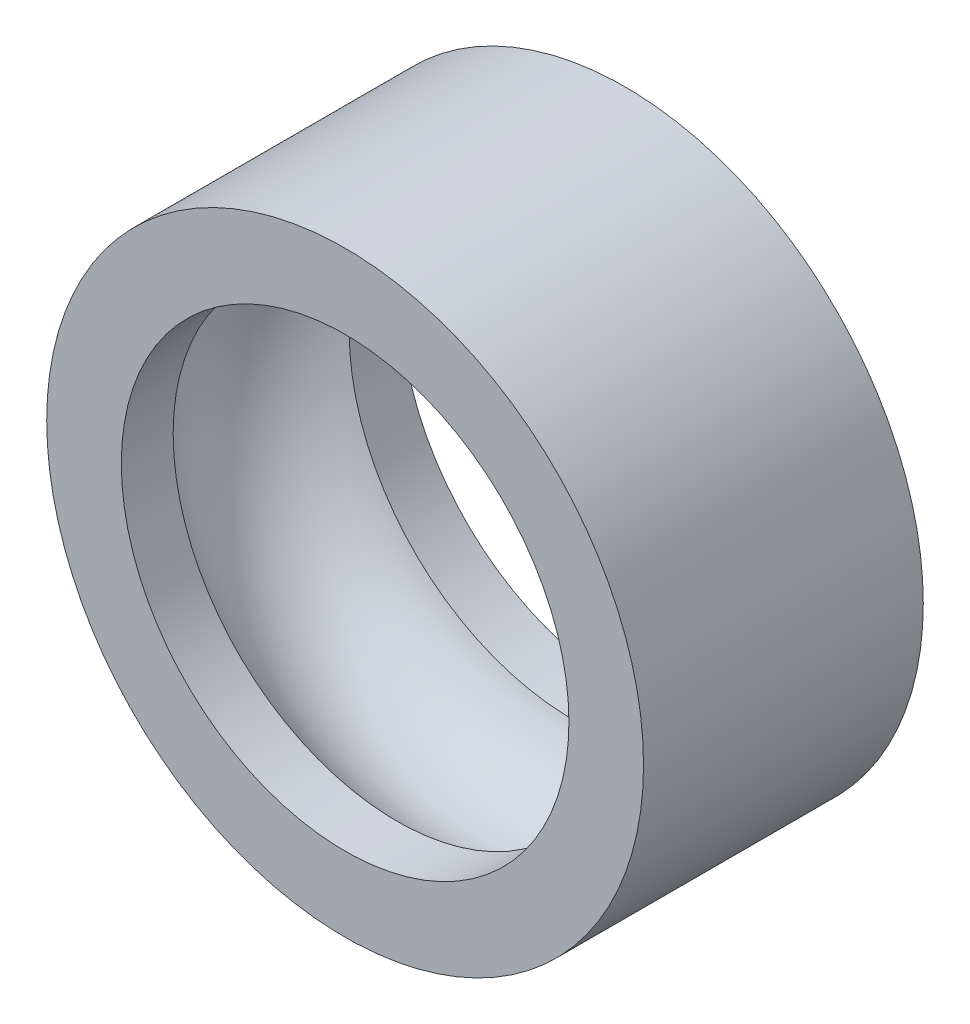
ISO-10303-21;
HEADER;
FILE_DESCRIPTION(('STEP AP214'),'2;1');
FILE_NAME('part.step','',(''),(''),'','','');
FILE_SCHEMA(('AUTOMOTIVE_DESIGN { 1 0 10303 214 1 1 1 1 }'));
ENDSEC;
DATA;
#1=APPLICATION_CONTEXT('core data for automotive mechanical design processes');
#2=APPLICATION_PROTOCOL_DEFINITION('international standard','automotive_design',2000,#1);
#3=PRODUCT_CONTEXT('',#1,'mechanical');
#4=PRODUCT('Part','Part','',(#3));
#5=PRODUCT_RELATED_PRODUCT_CATEGORY('part','',(#4));
#6=PRODUCT_DEFINITION_FORMATION('','',#4);
#7=PRODUCT_DEFINITION_CONTEXT('part definition',#1,'design');
#8=PRODUCT_DEFINITION('design','',#6,#7);
#9=PRODUCT_DEFINITION_SHAPE('','',#8);
#10=(LENGTH_UNIT() NAMED_UNIT(*) SI_UNIT(.MILLI.,.METRE.));
#11=(NAMED_UNIT(*) PLANE_ANGLE_UNIT() SI_UNIT($,.RADIAN.));
#12=(NAMED_UNIT(*) SI_UNIT($,.STERADIAN.) SOLID_ANGLE_UNIT());
#13=UNCERTAINTY_MEASURE_WITH_UNIT(LENGTH_MEASURE(1.E-05),#10,'distance_accuracy_value','');
#14=(GEOMETRIC_REPRESENTATION_CONTEXT(3) GLOBAL_UNCERTAINTY_ASSIGNED_CONTEXT((#13)) GLOBAL_UNIT_ASSIGNED_CONTEXT((#10,
#11,#12)) REPRESENTATION_CONTEXT('',''));
#15=CARTESIAN_POINT('',(0.,0.,0.));
#16=DIRECTION('',(0.,0.,1.));
#17=DIRECTION('',(1.,0.,0.));
#18=AXIS2_PLACEMENT_3D('',#15,#16,#17);
#19=CARTESIAN_POINT('',(0.,0.,3.));
#20=DIRECTION('',(0.,0.,-1.));
#21=DIRECTION('',(-1.,0.,0.));
#22=AXIS2_PLACEMENT_3D('',#19,#20,#21);
#23=CYLINDRICAL_SURFACE('',#22,2.4);
#24=CARTESIAN_POINT('',(0.,0.,0.556019067989189));
#25=DIRECTION('',(0.,0.,1.));
#26=DIRECTION('',(1.,0.,0.));
#27=AXIS2_PLACEMENT_3D('',#24,#25,#26);
#28=CIRCLE('',#27,2.4);
#29=CARTESIAN_POINT('',(2.4,0.,0.556019067989189));
#30=VERTEX_POINT('',#29);
#31=EDGE_CURVE('E43',#30,#30,#28,.F.);
#32=ORIENTED_EDGE('',*,*,#31,.F.);
#33=EDGE_LOOP('',(#32));
#34=FACE_BOUND('',#33,.T.);
#35=CARTESIAN_POINT('',(0.,0.,0.));
#36=DIRECTION('',(0.,0.,1.));
#37=DIRECTION('',(1.,0.,0.));
#38=AXIS2_PLACEMENT_3D('',#35,#36,#37);
#39=CIRCLE('',#38,2.4);
#40=CARTESIAN_POINT('',(2.4,0.,0.));
#41=VERTEX_POINT('',#40);
#42=EDGE_CURVE('E55',#41,#41,#39,.T.);
#43=ORIENTED_EDGE('',*,*,#42,.F.);
#44=EDGE_LOOP('',(#43));
#45=FACE_BOUND('',#44,.T.);
#46=ADVANCED_FACE('F39',(#34,#45),#23,.F.);
#47=CARTESIAN_POINT('',(0.,0.,3.));
#48=DIRECTION('',(0.,0.,1.));
#49=DIRECTION('',(1.,0.,0.));
#50=AXIS2_PLACEMENT_3D('',#47,#48,#49);
#51=PLANE('',#50);
#52=CARTESIAN_POINT('',(0.,0.,3.));
#53=DIRECTION('',(0.,0.,1.));
#54=DIRECTION('',(1.,0.,0.));
#55=AXIS2_PLACEMENT_3D('',#52,#53,#54);
#56=CIRCLE('',#55,3.2);
#57=CARTESIAN_POINT('',(3.2,0.,3.));
#58=VERTEX_POINT('',#57);
#59=EDGE_CURVE('E10',#58,#58,#56,.T.);
#60=ORIENTED_EDGE('',*,*,#59,.T.);
#61=EDGE_LOOP('',(#60));
#62=FACE_BOUND('',#61,.T.);
#63=CARTESIAN_POINT('',(0.,0.,3.));
#64=DIRECTION('',(0.,0.,1.));
#65=DIRECTION('',(1.,0.,0.));
#66=AXIS2_PLACEMENT_3D('',#63,#64,#65);
#67=CIRCLE('',#66,2.4);
#68=CARTESIAN_POINT('',(2.4,0.,3.));
#69=VERTEX_POINT('',#68);
#70=EDGE_CURVE('E52',#69,#69,#67,.T.);
#71=ORIENTED_EDGE('',*,*,#70,.F.);
#72=EDGE_LOOP('',(#71));
#73=FACE_BOUND('',#72,.T.);
#74=ADVANCED_FACE('F72',(#62,#73),#51,.T.);
#75=CARTESIAN_POINT('',(0.,0.,0.));
#76=DIRECTION('',(0.,0.,1.));
#77=DIRECTION('',(1.,0.,0.));
#78=AXIS2_PLACEMENT_3D('',#75,#76,#77);
#79=PLANE('',#78);
#80=CARTESIAN_POINT('',(0.,0.,0.));
#81=DIRECTION('',(0.,0.,1.));
#82=DIRECTION('',(1.,0.,0.));
#83=AXIS2_PLACEMENT_3D('',#80,#81,#82);
#84=CIRCLE('',#83,3.2);
#85=CARTESIAN_POINT('',(3.2,0.,0.));
#86=VERTEX_POINT('',#85);
#87=EDGE_CURVE('E47',#86,#86,#84,.T.);
#88=ORIENTED_EDGE('',*,*,#87,.F.);
#89=EDGE_LOOP('',(#88));
#90=FACE_BOUND('',#89,.T.);
#91=ORIENTED_EDGE('',*,*,#42,.T.);
#92=EDGE_LOOP('',(#91));
#93=FACE_BOUND('',#92,.T.);
#94=ADVANCED_FACE('F74',(#90,#93),#79,.F.);
#95=CARTESIAN_POINT('',(0.,0.,3.));
#96=DIRECTION('',(0.,0.,-1.));
#97=DIRECTION('',(-1.,0.,0.));
#98=AXIS2_PLACEMENT_3D('',#95,#96,#97);
#99=CYLINDRICAL_SURFACE('',#98,3.2);
#100=ORIENTED_EDGE('',*,*,#59,.F.);
#101=EDGE_LOOP('',(#100));
#102=FACE_BOUND('',#101,.T.);
#103=ORIENTED_EDGE('',*,*,#87,.T.);
#104=EDGE_LOOP('',(#103));
#105=FACE_BOUND('',#104,.T.);
#106=ADVANCED_FACE('F41',(#102,#105),#99,.T.);
#107=CARTESIAN_POINT('',(0.,0.,2.44398093201081));
#108=DIRECTION('',(0.,0.,-1.));
#109=DIRECTION('',(-1.,0.,0.));
#110=AXIS2_PLACEMENT_3D('',#107,#108,#109);
#111=CIRCLE('',#110,2.4);
#112=CARTESIAN_POINT('',(-2.4,0.,2.44398093201081));
#113=VERTEX_POINT('',#112);
#114=EDGE_CURVE('E57',#113,#113,#111,.F.);
#115=ORIENTED_EDGE('',*,*,#114,.F.);
#116=EDGE_LOOP('',(#115));
#117=FACE_BOUND('',#116,.T.);
#118=ORIENTED_EDGE('',*,*,#70,.T.);
#119=EDGE_LOOP('',(#118));
#120=FACE_BOUND('',#119,.T.);
#121=ADVANCED_FACE('F70',(#117,#120),#23,.F.);
#122=CARTESIAN_POINT('',(0.,0.,1.5));
#123=DIRECTION('',(0.,0.,-1.));
#124=DIRECTION('',(-1.,0.,0.));
#125=AXIS2_PLACEMENT_3D('',#122,#123,#124);
#126=TOROIDAL_SURFACE('',#125,2.07,1.);
#127=ORIENTED_EDGE('',*,*,#31,.T.);
#128=EDGE_LOOP('',(#127));
#129=FACE_BOUND('',#128,.T.);
#130=ORIENTED_EDGE('',*,*,#114,.T.);
#131=EDGE_LOOP('',(#130));
#132=FACE_BOUND('',#131,.T.);
#133=ADVANCED_FACE('F85',(#129,#132),#126,.F.);
#134=CLOSED_SHELL('',(#46,#74,#94,#106,#121,#133));
#135=MANIFOLD_SOLID_BREP('B2',#134);
#136=ADVANCED_BREP_SHAPE_REPRESENTATION('',(#18,#135),#14);
#137=SHAPE_DEFINITION_REPRESENTATION(#9,#136);
ENDSEC;
END-ISO-10303-21;
